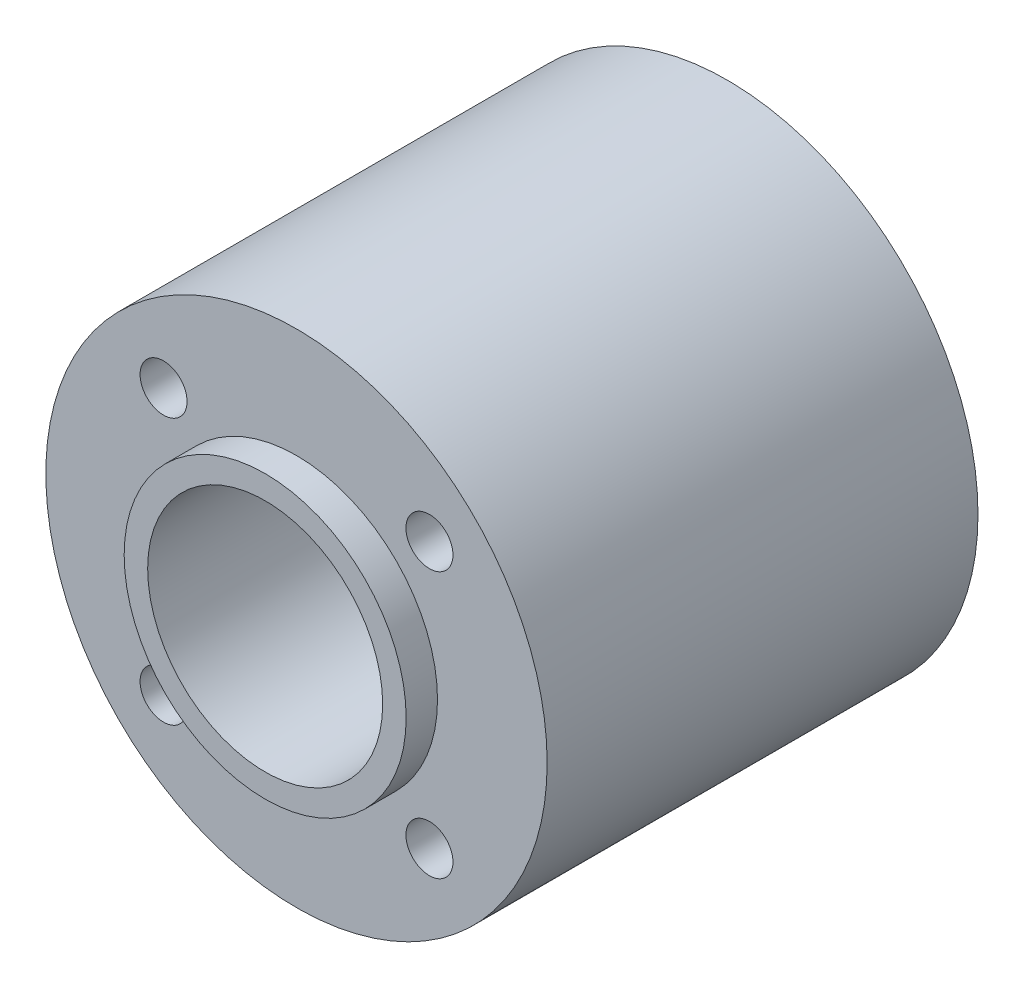
ISO-10303-21;
HEADER;
FILE_DESCRIPTION(('STEP AP214'),'2;1');
FILE_NAME('part.step','',(''),(''),'','','');
FILE_SCHEMA(('AUTOMOTIVE_DESIGN { 1 0 10303 214 1 1 1 1 }'));
ENDSEC;
DATA;
#1=APPLICATION_CONTEXT('core data for automotive mechanical design processes');
#2=APPLICATION_PROTOCOL_DEFINITION('international standard','automotive_design',2000,#1);
#3=PRODUCT_CONTEXT('',#1,'mechanical');
#4=PRODUCT('Part','Part','',(#3));
#5=PRODUCT_RELATED_PRODUCT_CATEGORY('part','',(#4));
#6=PRODUCT_DEFINITION_FORMATION('','',#4);
#7=PRODUCT_DEFINITION_CONTEXT('part definition',#1,'design');
#8=PRODUCT_DEFINITION('design','',#6,#7);
#9=PRODUCT_DEFINITION_SHAPE('','',#8);
#10=(LENGTH_UNIT() NAMED_UNIT(*) SI_UNIT(.MILLI.,.METRE.));
#11=(NAMED_UNIT(*) PLANE_ANGLE_UNIT() SI_UNIT($,.RADIAN.));
#12=(NAMED_UNIT(*) SI_UNIT($,.STERADIAN.) SOLID_ANGLE_UNIT());
#13=UNCERTAINTY_MEASURE_WITH_UNIT(LENGTH_MEASURE(1.E-05),#10,'distance_accuracy_value','');
#14=(GEOMETRIC_REPRESENTATION_CONTEXT(3) GLOBAL_UNCERTAINTY_ASSIGNED_CONTEXT((#13)) GLOBAL_UNIT_ASSIGNED_CONTEXT((#10,
#11,#12)) REPRESENTATION_CONTEXT('',''));
#15=CARTESIAN_POINT('',(0.,0.,0.));
#16=DIRECTION('',(0.,0.,1.));
#17=DIRECTION('',(1.,0.,0.));
#18=AXIS2_PLACEMENT_3D('',#15,#16,#17);
#19=CARTESIAN_POINT('',(0.,0.,-27.5));
#20=DIRECTION('',(0.,0.,1.));
#21=DIRECTION('',(1.,0.,0.));
#22=AXIS2_PLACEMENT_3D('',#19,#20,#21);
#23=CYLINDRICAL_SURFACE('',#22,16.);
#24=CARTESIAN_POINT('',(0.,0.,-27.5));
#25=DIRECTION('',(0.,0.,1.));
#26=DIRECTION('',(1.,0.,0.));
#27=AXIS2_PLACEMENT_3D('',#24,#25,#26);
#28=CIRCLE('',#27,16.);
#29=CARTESIAN_POINT('',(16.,0.,-27.5));
#30=VERTEX_POINT('',#29);
#31=EDGE_CURVE('E11',#30,#30,#28,.T.);
#32=ORIENTED_EDGE('',*,*,#31,.T.);
#33=EDGE_LOOP('',(#32));
#34=FACE_BOUND('',#33,.T.);
#35=CARTESIAN_POINT('',(0.,0.,0.));
#36=DIRECTION('',(0.,0.,1.));
#37=DIRECTION('',(1.,0.,0.));
#38=AXIS2_PLACEMENT_3D('',#35,#36,#37);
#39=CIRCLE('',#38,16.);
#40=CARTESIAN_POINT('',(16.,0.,0.));
#41=VERTEX_POINT('',#40);
#42=EDGE_CURVE('E49',#41,#41,#39,.T.);
#43=ORIENTED_EDGE('',*,*,#42,.F.);
#44=EDGE_LOOP('',(#43));
#45=FACE_BOUND('',#44,.T.);
#46=ADVANCED_FACE('F46',(#34,#45),#23,.T.);
#47=CARTESIAN_POINT('',(0.,0.,-27.5));
#48=DIRECTION('',(0.,0.,1.));
#49=DIRECTION('',(1.,0.,0.));
#50=AXIS2_PLACEMENT_3D('',#47,#48,#49);
#51=CYLINDRICAL_SURFACE('',#50,7.5);
#52=CARTESIAN_POINT('',(0.,0.,2.));
#53=DIRECTION('',(0.,0.,1.));
#54=DIRECTION('',(1.,0.,0.));
#55=AXIS2_PLACEMENT_3D('',#52,#53,#54);
#56=CIRCLE('',#55,7.5);
#57=CARTESIAN_POINT('',(7.5,0.,2.));
#58=VERTEX_POINT('',#57);
#59=EDGE_CURVE('E64',#58,#58,#56,.T.);
#60=ORIENTED_EDGE('',*,*,#59,.T.);
#61=EDGE_LOOP('',(#60));
#62=FACE_BOUND('',#61,.T.);
#63=CARTESIAN_POINT('',(0.,0.,-29.5));
#64=DIRECTION('',(0.,0.,1.));
#65=DIRECTION('',(1.,0.,0.));
#66=AXIS2_PLACEMENT_3D('',#63,#64,#65);
#67=CIRCLE('',#66,7.5);
#68=CARTESIAN_POINT('',(7.5,0.,-29.5));
#69=VERTEX_POINT('',#68);
#70=EDGE_CURVE('E76',#69,#69,#67,.T.);
#71=ORIENTED_EDGE('',*,*,#70,.F.);
#72=EDGE_LOOP('',(#71));
#73=FACE_BOUND('',#72,.T.);
#74=ADVANCED_FACE('F133',(#62,#73),#51,.F.);
#75=CARTESIAN_POINT('',(0.,0.,-27.5));
#76=DIRECTION('',(0.,0.,1.));
#77=DIRECTION('',(1.,0.,0.));
#78=AXIS2_PLACEMENT_3D('',#75,#76,#77);
#79=PLANE('',#78);
#80=CARTESIAN_POINT('',(-8.48528137423858,-8.48528137423887,-27.5));
#81=DIRECTION('',(0.,0.,1.));
#82=DIRECTION('',(1.,0.,0.));
#83=AXIS2_PLACEMENT_3D('',#80,#81,#82);
#84=CIRCLE('',#83,1.50000000000038);
#85=CARTESIAN_POINT('',(-6.98528137423821,-8.48528137423887,-27.5));
#86=VERTEX_POINT('',#85);
#87=EDGE_CURVE('E83',#86,#86,#84,.T.);
#88=ORIENTED_EDGE('',*,*,#87,.T.);
#89=EDGE_LOOP('',(#88));
#90=FACE_BOUND('',#89,.T.);
#91=CARTESIAN_POINT('',(8.48528137423884,-8.48528137423887,-27.5));
#92=DIRECTION('',(0.,0.,1.));
#93=DIRECTION('',(1.,0.,0.));
#94=AXIS2_PLACEMENT_3D('',#91,#92,#93);
#95=CIRCLE('',#94,1.50000000000023);
#96=CARTESIAN_POINT('',(9.98528137423907,-8.48528137423887,-27.5));
#97=VERTEX_POINT('',#96);
#98=EDGE_CURVE('E87',#97,#97,#95,.T.);
#99=ORIENTED_EDGE('',*,*,#98,.T.);
#100=EDGE_LOOP('',(#99));
#101=FACE_BOUND('',#100,.T.);
#102=CARTESIAN_POINT('',(8.48528137423884,8.48528137423855,-27.5));
#103=DIRECTION('',(0.,0.,1.));
#104=DIRECTION('',(1.,0.,0.));
#105=AXIS2_PLACEMENT_3D('',#102,#103,#104);
#106=CIRCLE('',#105,1.49999999999992);
#107=CARTESIAN_POINT('',(9.98528137423876,8.48528137423855,-27.5));
#108=VERTEX_POINT('',#107);
#109=EDGE_CURVE('E91',#108,#108,#106,.T.);
#110=ORIENTED_EDGE('',*,*,#109,.T.);
#111=EDGE_LOOP('',(#110));
#112=FACE_BOUND('',#111,.T.);
#113=CARTESIAN_POINT('',(-8.48528137423859,8.48528137423855,-27.5));
#114=DIRECTION('',(0.,0.,1.));
#115=DIRECTION('',(1.,0.,0.));
#116=AXIS2_PLACEMENT_3D('',#113,#114,#115);
#117=CIRCLE('',#116,1.5);
#118=CARTESIAN_POINT('',(-6.98528137423859,8.48528137423855,-27.5));
#119=VERTEX_POINT('',#118);
#120=EDGE_CURVE('E95',#119,#119,#117,.T.);
#121=ORIENTED_EDGE('',*,*,#120,.T.);
#122=EDGE_LOOP('',(#121));
#123=FACE_BOUND('',#122,.T.);
#124=CARTESIAN_POINT('',(0.,0.,-27.5));
#125=DIRECTION('',(0.,0.,1.));
#126=DIRECTION('',(1.,0.,0.));
#127=AXIS2_PLACEMENT_3D('',#124,#125,#126);
#128=CIRCLE('',#127,9.);
#129=CARTESIAN_POINT('',(9.,0.,-27.5));
#130=VERTEX_POINT('',#129);
#131=EDGE_CURVE('E72',#130,#130,#128,.T.);
#132=ORIENTED_EDGE('',*,*,#131,.T.);
#133=EDGE_LOOP('',(#132));
#134=FACE_BOUND('',#133,.T.);
#135=ORIENTED_EDGE('',*,*,#31,.F.);
#136=EDGE_LOOP('',(#135));
#137=FACE_BOUND('',#136,.T.);
#138=ADVANCED_FACE('F123',(#90,#101,#112,#123,#134,#137),#79,.F.);
#139=CARTESIAN_POINT('',(0.,0.,0.));
#140=DIRECTION('',(0.,0.,1.));
#141=DIRECTION('',(1.,0.,0.));
#142=AXIS2_PLACEMENT_3D('',#139,#140,#141);
#143=PLANE('',#142);
#144=CARTESIAN_POINT('',(-8.48528137423858,-8.48528137423887,0.));
#145=DIRECTION('',(0.,0.,1.));
#146=DIRECTION('',(1.,0.,0.));
#147=AXIS2_PLACEMENT_3D('',#144,#145,#146);
#148=CIRCLE('',#147,1.50000000000038);
#149=CARTESIAN_POINT('',(-6.98528137423821,-8.48528137423887,0.));
#150=VERTEX_POINT('',#149);
#151=EDGE_CURVE('E104',#150,#150,#148,.T.);
#152=ORIENTED_EDGE('',*,*,#151,.F.);
#153=EDGE_LOOP('',(#152));
#154=FACE_BOUND('',#153,.T.);
#155=CARTESIAN_POINT('',(8.48528137423884,-8.48528137423887,0.));
#156=DIRECTION('',(0.,0.,1.));
#157=DIRECTION('',(1.,0.,0.));
#158=AXIS2_PLACEMENT_3D('',#155,#156,#157);
#159=CIRCLE('',#158,1.50000000000023);
#160=CARTESIAN_POINT('',(9.98528137423907,-8.48528137423887,0.));
#161=VERTEX_POINT('',#160);
#162=EDGE_CURVE('E108',#161,#161,#159,.T.);
#163=ORIENTED_EDGE('',*,*,#162,.F.);
#164=EDGE_LOOP('',(#163));
#165=FACE_BOUND('',#164,.T.);
#166=CARTESIAN_POINT('',(8.48528137423884,8.48528137423855,0.));
#167=DIRECTION('',(0.,0.,1.));
#168=DIRECTION('',(1.,0.,0.));
#169=AXIS2_PLACEMENT_3D('',#166,#167,#168);
#170=CIRCLE('',#169,1.49999999999992);
#171=CARTESIAN_POINT('',(9.98528137423876,8.48528137423855,0.));
#172=VERTEX_POINT('',#171);
#173=EDGE_CURVE('E103',#172,#172,#170,.T.);
#174=ORIENTED_EDGE('',*,*,#173,.F.);
#175=EDGE_LOOP('',(#174));
#176=FACE_BOUND('',#175,.T.);
#177=CARTESIAN_POINT('',(-8.48528137423859,8.48528137423855,0.));
#178=DIRECTION('',(0.,0.,1.));
#179=DIRECTION('',(1.,0.,0.));
#180=AXIS2_PLACEMENT_3D('',#177,#178,#179);
#181=CIRCLE('',#180,1.5);
#182=CARTESIAN_POINT('',(-6.98528137423859,8.48528137423855,0.));
#183=VERTEX_POINT('',#182);
#184=EDGE_CURVE('E99',#183,#183,#181,.T.);
#185=ORIENTED_EDGE('',*,*,#184,.F.);
#186=EDGE_LOOP('',(#185));
#187=FACE_BOUND('',#186,.T.);
#188=CARTESIAN_POINT('',(0.,0.,0.));
#189=DIRECTION('',(0.,0.,1.));
#190=DIRECTION('',(1.,0.,0.));
#191=AXIS2_PLACEMENT_3D('',#188,#189,#190);
#192=CIRCLE('',#191,9.);
#193=CARTESIAN_POINT('',(9.,0.,0.));
#194=VERTEX_POINT('',#193);
#195=EDGE_CURVE('E60',#194,#194,#192,.T.);
#196=ORIENTED_EDGE('',*,*,#195,.F.);
#197=EDGE_LOOP('',(#196));
#198=FACE_BOUND('',#197,.T.);
#199=ORIENTED_EDGE('',*,*,#42,.T.);
#200=EDGE_LOOP('',(#199));
#201=FACE_BOUND('',#200,.T.);
#202=ADVANCED_FACE('F119',(#154,#165,#176,#187,#198,#201),#143,.T.);
#203=CARTESIAN_POINT('',(0.,0.,2.));
#204=DIRECTION('',(0.,0.,-1.));
#205=DIRECTION('',(-1.,0.,0.));
#206=AXIS2_PLACEMENT_3D('',#203,#204,#205);
#207=CYLINDRICAL_SURFACE('',#206,9.);
#208=CARTESIAN_POINT('',(0.,0.,2.));
#209=DIRECTION('',(0.,0.,1.));
#210=DIRECTION('',(1.,0.,0.));
#211=AXIS2_PLACEMENT_3D('',#208,#209,#210);
#212=CIRCLE('',#211,9.);
#213=CARTESIAN_POINT('',(9.,0.,2.));
#214=VERTEX_POINT('',#213);
#215=EDGE_CURVE('E58',#214,#214,#212,.T.);
#216=ORIENTED_EDGE('',*,*,#215,.F.);
#217=EDGE_LOOP('',(#216));
#218=FACE_BOUND('',#217,.T.);
#219=ORIENTED_EDGE('',*,*,#195,.T.);
#220=EDGE_LOOP('',(#219));
#221=FACE_BOUND('',#220,.T.);
#222=ADVANCED_FACE('F122',(#218,#221),#207,.T.);
#223=CARTESIAN_POINT('',(0.,0.,2.));
#224=DIRECTION('',(0.,0.,1.));
#225=DIRECTION('',(1.,0.,0.));
#226=AXIS2_PLACEMENT_3D('',#223,#224,#225);
#227=PLANE('',#226);
#228=ORIENTED_EDGE('',*,*,#59,.F.);
#229=EDGE_LOOP('',(#228));
#230=FACE_BOUND('',#229,.T.);
#231=ORIENTED_EDGE('',*,*,#215,.T.);
#232=EDGE_LOOP('',(#231));
#233=FACE_BOUND('',#232,.T.);
#234=ADVANCED_FACE('F148',(#230,#233),#227,.T.);
#235=CARTESIAN_POINT('',(0.,0.,-29.5));
#236=DIRECTION('',(0.,0.,1.));
#237=DIRECTION('',(1.,0.,0.));
#238=AXIS2_PLACEMENT_3D('',#235,#236,#237);
#239=CYLINDRICAL_SURFACE('',#238,9.);
#240=CARTESIAN_POINT('',(0.,0.,-29.5));
#241=DIRECTION('',(0.,0.,1.));
#242=DIRECTION('',(1.,0.,0.));
#243=AXIS2_PLACEMENT_3D('',#240,#241,#242);
#244=CIRCLE('',#243,9.);
#245=CARTESIAN_POINT('',(9.,0.,-29.5));
#246=VERTEX_POINT('',#245);
#247=EDGE_CURVE('E65',#246,#246,#244,.T.);
#248=ORIENTED_EDGE('',*,*,#247,.T.);
#249=EDGE_LOOP('',(#248));
#250=FACE_BOUND('',#249,.T.);
#251=ORIENTED_EDGE('',*,*,#131,.F.);
#252=EDGE_LOOP('',(#251));
#253=FACE_BOUND('',#252,.T.);
#254=ADVANCED_FACE('F152',(#250,#253),#239,.T.);
#255=CARTESIAN_POINT('',(0.,0.,-29.5));
#256=DIRECTION('',(0.,0.,1.));
#257=DIRECTION('',(1.,0.,0.));
#258=AXIS2_PLACEMENT_3D('',#255,#256,#257);
#259=PLANE('',#258);
#260=ORIENTED_EDGE('',*,*,#70,.T.);
#261=EDGE_LOOP('',(#260));
#262=FACE_BOUND('',#261,.T.);
#263=ORIENTED_EDGE('',*,*,#247,.F.);
#264=EDGE_LOOP('',(#263));
#265=FACE_BOUND('',#264,.T.);
#266=ADVANCED_FACE('F156',(#262,#265),#259,.F.);
#267=CARTESIAN_POINT('',(-8.48528137423859,8.48528137423855,-29.5));
#268=DIRECTION('',(0.,0.,1.));
#269=DIRECTION('',(1.,0.,0.));
#270=AXIS2_PLACEMENT_3D('',#267,#268,#269);
#271=CYLINDRICAL_SURFACE('',#270,1.5);
#272=ORIENTED_EDGE('',*,*,#184,.T.);
#273=EDGE_LOOP('',(#272));
#274=FACE_BOUND('',#273,.T.);
#275=ORIENTED_EDGE('',*,*,#120,.F.);
#276=EDGE_LOOP('',(#275));
#277=FACE_BOUND('',#276,.T.);
#278=ADVANCED_FACE('F160',(#274,#277),#271,.F.);
#279=CARTESIAN_POINT('',(8.48528137423884,8.48528137423855,-29.5));
#280=DIRECTION('',(0.,0.,1.));
#281=DIRECTION('',(1.,0.,0.));
#282=AXIS2_PLACEMENT_3D('',#279,#280,#281);
#283=CYLINDRICAL_SURFACE('',#282,1.49999999999992);
#284=ORIENTED_EDGE('',*,*,#173,.T.);
#285=EDGE_LOOP('',(#284));
#286=FACE_BOUND('',#285,.T.);
#287=ORIENTED_EDGE('',*,*,#109,.F.);
#288=EDGE_LOOP('',(#287));
#289=FACE_BOUND('',#288,.T.);
#290=ADVANCED_FACE('F116',(#286,#289),#283,.F.);
#291=CARTESIAN_POINT('',(8.48528137423884,-8.48528137423887,-29.5));
#292=DIRECTION('',(0.,0.,1.));
#293=DIRECTION('',(1.,0.,0.));
#294=AXIS2_PLACEMENT_3D('',#291,#292,#293);
#295=CYLINDRICAL_SURFACE('',#294,1.50000000000023);
#296=ORIENTED_EDGE('',*,*,#162,.T.);
#297=EDGE_LOOP('',(#296));
#298=FACE_BOUND('',#297,.T.);
#299=ORIENTED_EDGE('',*,*,#98,.F.);
#300=EDGE_LOOP('',(#299));
#301=FACE_BOUND('',#300,.T.);
#302=ADVANCED_FACE('F168',(#298,#301),#295,.F.);
#303=CARTESIAN_POINT('',(-8.48528137423858,-8.48528137423887,-29.5));
#304=DIRECTION('',(0.,0.,1.));
#305=DIRECTION('',(1.,0.,0.));
#306=AXIS2_PLACEMENT_3D('',#303,#304,#305);
#307=CYLINDRICAL_SURFACE('',#306,1.50000000000038);
#308=ORIENTED_EDGE('',*,*,#151,.T.);
#309=EDGE_LOOP('',(#308));
#310=FACE_BOUND('',#309,.T.);
#311=ORIENTED_EDGE('',*,*,#87,.F.);
#312=EDGE_LOOP('',(#311));
#313=FACE_BOUND('',#312,.T.);
#314=ADVANCED_FACE('F165',(#310,#313),#307,.F.);
#315=CLOSED_SHELL('',(#46,#74,#138,#202,#222,#234,#254,#266,#278,#290,#302,#314));
#316=MANIFOLD_SOLID_BREP('B2',#315);
#317=ADVANCED_BREP_SHAPE_REPRESENTATION('',(#18,#316),#14);
#318=SHAPE_DEFINITION_REPRESENTATION(#9,#317);
ENDSEC;
END-ISO-10303-21;
